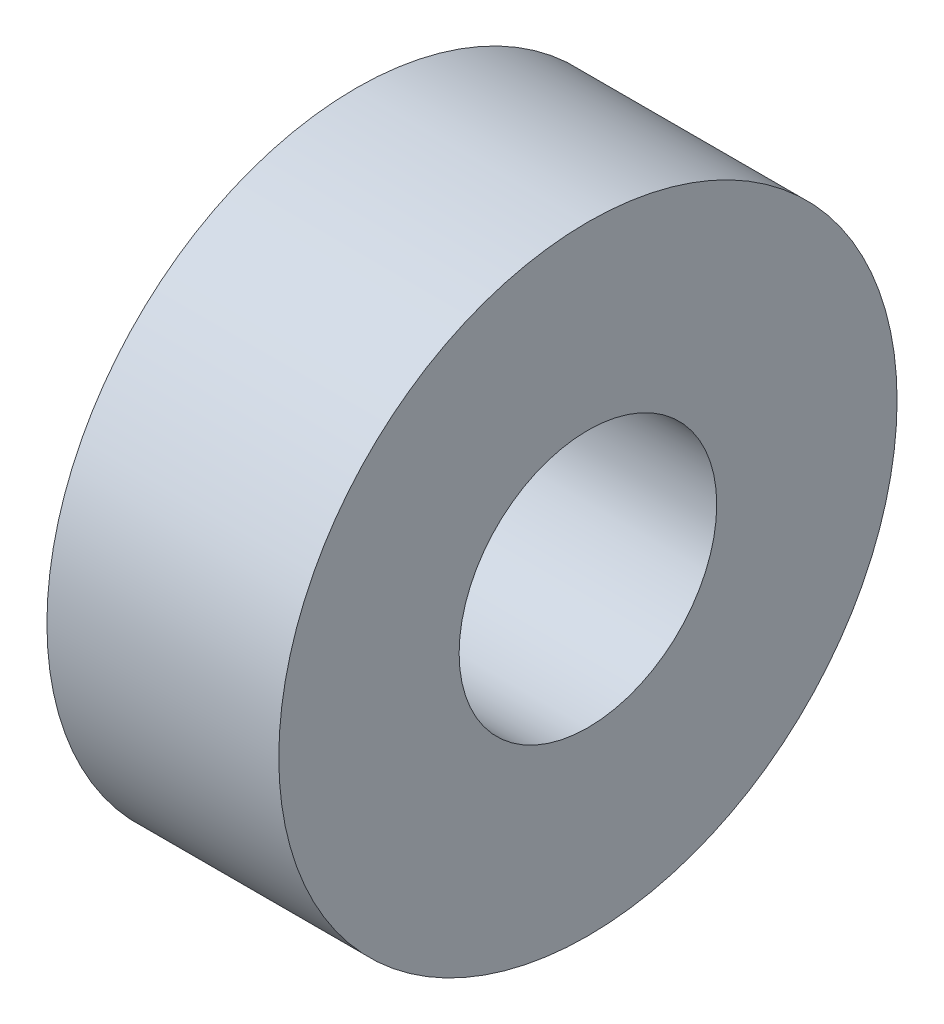
ISO-10303-21;
HEADER;
FILE_DESCRIPTION(('STEP AP214'),'2;1');
FILE_NAME('part.step','',(''),(''),'','','');
FILE_SCHEMA(('AUTOMOTIVE_DESIGN { 1 0 10303 214 1 1 1 1 }'));
ENDSEC;
DATA;
#1=APPLICATION_CONTEXT('core data for automotive mechanical design processes');
#2=APPLICATION_PROTOCOL_DEFINITION('international standard','automotive_design',2000,#1);
#3=PRODUCT_CONTEXT('',#1,'mechanical');
#4=PRODUCT('Part','Part','',(#3));
#5=PRODUCT_RELATED_PRODUCT_CATEGORY('part','',(#4));
#6=PRODUCT_DEFINITION_FORMATION('','',#4);
#7=PRODUCT_DEFINITION_CONTEXT('part definition',#1,'design');
#8=PRODUCT_DEFINITION('design','',#6,#7);
#9=PRODUCT_DEFINITION_SHAPE('','',#8);
#10=(LENGTH_UNIT() NAMED_UNIT(*) SI_UNIT(.MILLI.,.METRE.));
#11=(NAMED_UNIT(*) PLANE_ANGLE_UNIT() SI_UNIT($,.RADIAN.));
#12=(NAMED_UNIT(*) SI_UNIT($,.STERADIAN.) SOLID_ANGLE_UNIT());
#13=UNCERTAINTY_MEASURE_WITH_UNIT(LENGTH_MEASURE(1.E-05),#10,'distance_accuracy_value','');
#14=(GEOMETRIC_REPRESENTATION_CONTEXT(3) GLOBAL_UNCERTAINTY_ASSIGNED_CONTEXT((#13)) GLOBAL_UNIT_ASSIGNED_CONTEXT((#10,
#11,#12)) REPRESENTATION_CONTEXT('',''));
#15=CARTESIAN_POINT('',(0.,0.,0.));
#16=DIRECTION('',(0.,0.,1.));
#17=DIRECTION('',(1.,0.,0.));
#18=AXIS2_PLACEMENT_3D('',#15,#16,#17);
#19=CARTESIAN_POINT('',(0.,12.,0.));
#20=DIRECTION('',(1.,0.,0.));
#21=DIRECTION('',(0.,0.,-1.));
#22=AXIS2_PLACEMENT_3D('',#19,#20,#21);
#23=PLANE('',#22);
#24=CARTESIAN_POINT('',(0.,0.,0.));
#25=DIRECTION('',(-1.,0.,0.));
#26=DIRECTION('',(0.,0.,1.));
#27=AXIS2_PLACEMENT_3D('',#24,#25,#26);
#28=CIRCLE('',#27,5.);
#29=CARTESIAN_POINT('',(0.,0.,5.));
#30=VERTEX_POINT('',#29);
#31=EDGE_CURVE('E10',#30,#30,#28,.T.);
#32=ORIENTED_EDGE('',*,*,#31,.F.);
#33=EDGE_LOOP('',(#32));
#34=FACE_BOUND('',#33,.T.);
#35=CARTESIAN_POINT('',(0.,0.,0.));
#36=DIRECTION('',(-1.,0.,0.));
#37=DIRECTION('',(0.,0.,1.));
#38=AXIS2_PLACEMENT_3D('',#35,#36,#37);
#39=CIRCLE('',#38,12.);
#40=CARTESIAN_POINT('',(0.,0.,12.));
#41=VERTEX_POINT('',#40);
#42=EDGE_CURVE('E60',#41,#41,#39,.T.);
#43=ORIENTED_EDGE('',*,*,#42,.T.);
#44=EDGE_LOOP('',(#43));
#45=FACE_BOUND('',#44,.T.);
#46=ADVANCED_FACE('F43',(#34,#45),#23,.F.);
#47=CARTESIAN_POINT('',(0.,0.,0.));
#48=DIRECTION('',(-1.,0.,0.));
#49=DIRECTION('',(0.,0.,1.));
#50=AXIS2_PLACEMENT_3D('',#47,#48,#49);
#51=CYLINDRICAL_SURFACE('',#50,5.);
#52=CARTESIAN_POINT('',(9.,0.,0.));
#53=DIRECTION('',(-1.,0.,0.));
#54=DIRECTION('',(0.,0.,1.));
#55=AXIS2_PLACEMENT_3D('',#52,#53,#54);
#56=CIRCLE('',#55,5.);
#57=CARTESIAN_POINT('',(9.,0.,5.));
#58=VERTEX_POINT('',#57);
#59=EDGE_CURVE('E50',#58,#58,#56,.T.);
#60=ORIENTED_EDGE('',*,*,#59,.F.);
#61=EDGE_LOOP('',(#60));
#62=FACE_BOUND('',#61,.T.);
#63=ORIENTED_EDGE('',*,*,#31,.T.);
#64=EDGE_LOOP('',(#63));
#65=FACE_BOUND('',#64,.T.);
#66=ADVANCED_FACE('F76',(#62,#65),#51,.F.);
#67=CARTESIAN_POINT('',(9.,5.,0.));
#68=DIRECTION('',(-1.,0.,0.));
#69=DIRECTION('',(0.,0.,1.));
#70=AXIS2_PLACEMENT_3D('',#67,#68,#69);
#71=PLANE('',#70);
#72=CARTESIAN_POINT('',(9.,0.,0.));
#73=DIRECTION('',(-1.,0.,0.));
#74=DIRECTION('',(0.,0.,1.));
#75=AXIS2_PLACEMENT_3D('',#72,#73,#74);
#76=CIRCLE('',#75,12.);
#77=CARTESIAN_POINT('',(9.,0.,12.));
#78=VERTEX_POINT('',#77);
#79=EDGE_CURVE('E55',#78,#78,#76,.T.);
#80=ORIENTED_EDGE('',*,*,#79,.F.);
#81=EDGE_LOOP('',(#80));
#82=FACE_BOUND('',#81,.T.);
#83=ORIENTED_EDGE('',*,*,#59,.T.);
#84=EDGE_LOOP('',(#83));
#85=FACE_BOUND('',#84,.T.);
#86=ADVANCED_FACE('F71',(#82,#85),#71,.F.);
#87=CARTESIAN_POINT('',(0.,0.,0.));
#88=DIRECTION('',(-1.,0.,0.));
#89=DIRECTION('',(0.,0.,1.));
#90=AXIS2_PLACEMENT_3D('',#87,#88,#89);
#91=CYLINDRICAL_SURFACE('',#90,12.);
#92=ORIENTED_EDGE('',*,*,#42,.F.);
#93=EDGE_LOOP('',(#92));
#94=FACE_BOUND('',#93,.T.);
#95=ORIENTED_EDGE('',*,*,#79,.T.);
#96=EDGE_LOOP('',(#95));
#97=FACE_BOUND('',#96,.T.);
#98=ADVANCED_FACE('F68',(#94,#97),#91,.T.);
#99=CLOSED_SHELL('',(#46,#66,#86,#98));
#100=MANIFOLD_SOLID_BREP('B2',#99);
#101=ADVANCED_BREP_SHAPE_REPRESENTATION('',(#18,#100),#14);
#102=SHAPE_DEFINITION_REPRESENTATION(#9,#101);
ENDSEC;
END-ISO-10303-21;
